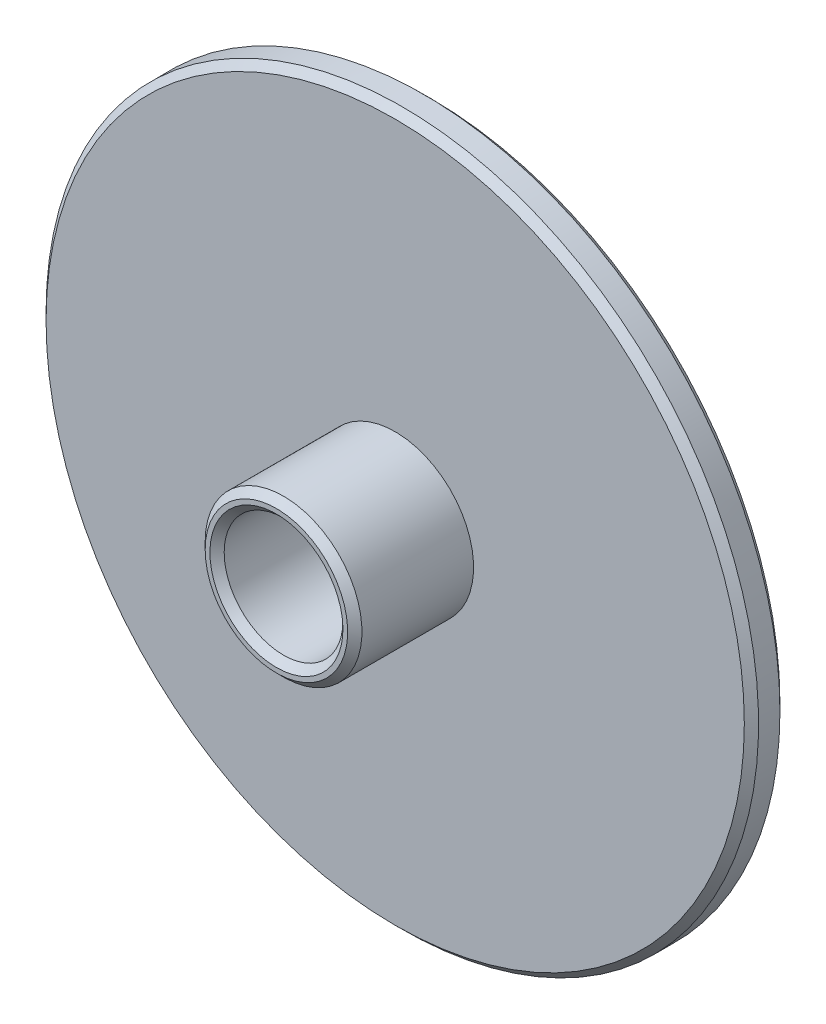
ISO-10303-21;
HEADER;
FILE_DESCRIPTION(('STEP AP214'),'2;1');
FILE_NAME('part.step','',(''),(''),'','','');
FILE_SCHEMA(('AUTOMOTIVE_DESIGN { 1 0 10303 214 1 1 1 1 }'));
ENDSEC;
DATA;
#1=APPLICATION_CONTEXT('core data for automotive mechanical design processes');
#2=APPLICATION_PROTOCOL_DEFINITION('international standard','automotive_design',2000,#1);
#3=PRODUCT_CONTEXT('',#1,'mechanical');
#4=PRODUCT('Part','Part','',(#3));
#5=PRODUCT_RELATED_PRODUCT_CATEGORY('part','',(#4));
#6=PRODUCT_DEFINITION_FORMATION('','',#4);
#7=PRODUCT_DEFINITION_CONTEXT('part definition',#1,'design');
#8=PRODUCT_DEFINITION('design','',#6,#7);
#9=PRODUCT_DEFINITION_SHAPE('','',#8);
#10=(LENGTH_UNIT() NAMED_UNIT(*) SI_UNIT(.MILLI.,.METRE.));
#11=(NAMED_UNIT(*) PLANE_ANGLE_UNIT() SI_UNIT($,.RADIAN.));
#12=(NAMED_UNIT(*) SI_UNIT($,.STERADIAN.) SOLID_ANGLE_UNIT());
#13=UNCERTAINTY_MEASURE_WITH_UNIT(LENGTH_MEASURE(1.E-05),#10,'distance_accuracy_value','');
#14=(GEOMETRIC_REPRESENTATION_CONTEXT(3) GLOBAL_UNCERTAINTY_ASSIGNED_CONTEXT((#13)) GLOBAL_UNIT_ASSIGNED_CONTEXT((#10,
#11,#12)) REPRESENTATION_CONTEXT('',''));
#15=CARTESIAN_POINT('',(0.,0.,0.));
#16=DIRECTION('',(0.,0.,1.));
#17=DIRECTION('',(1.,0.,0.));
#18=AXIS2_PLACEMENT_3D('',#15,#16,#17);
#19=CARTESIAN_POINT('',(0.,0.,1.5));
#20=DIRECTION('',(0.,0.,1.));
#21=DIRECTION('',(1.,0.,0.));
#22=AXIS2_PLACEMENT_3D('',#19,#20,#21);
#23=PLANE('',#22);
#24=CARTESIAN_POINT('',(0.,0.,1.5));
#25=DIRECTION('',(0.,0.,-1.));
#26=DIRECTION('',(-1.,0.,0.));
#27=AXIS2_PLACEMENT_3D('',#24,#25,#26);
#28=CIRCLE('',#27,2.5);
#29=CARTESIAN_POINT('',(-2.5,0.,1.5));
#30=VERTEX_POINT('',#29);
#31=EDGE_CURVE('E16',#30,#30,#28,.F.);
#32=ORIENTED_EDGE('',*,*,#31,.T.);
#33=EDGE_LOOP('',(#32));
#34=FACE_BOUND('',#33,.T.);
#35=ADVANCED_FACE('F13',(#34),#23,.T.);
#36=CARTESIAN_POINT('',(0.,0.,6.5));
#37=DIRECTION('',(0.,0.,-1.));
#38=DIRECTION('',(-1.,0.,0.));
#39=AXIS2_PLACEMENT_3D('',#36,#37,#38);
#40=CYLINDRICAL_SURFACE('',#39,2.5);
#41=CARTESIAN_POINT('',(0.,0.,6.19999999997844));
#42=DIRECTION('',(0.,0.,1.));
#43=DIRECTION('',(1.,0.,0.));
#44=AXIS2_PLACEMENT_3D('',#41,#42,#43);
#45=CIRCLE('',#44,2.49999999994088);
#46=CARTESIAN_POINT('',(2.49999999994088,0.,6.19999999997844));
#47=VERTEX_POINT('',#46);
#48=EDGE_CURVE('E29',#47,#47,#45,.T.);
#49=ORIENTED_EDGE('',*,*,#48,.T.);
#50=EDGE_LOOP('',(#49));
#51=FACE_BOUND('',#50,.T.);
#52=ORIENTED_EDGE('',*,*,#31,.F.);
#53=EDGE_LOOP('',(#52));
#54=FACE_BOUND('',#53,.T.);
#55=ADVANCED_FACE('F57',(#51,#54),#40,.F.);
#56=CARTESIAN_POINT('',(0.,0.,6.50000000001683));
#57=DIRECTION('',(0.,0.,1.));
#58=DIRECTION('',(0.,-1.,0.));
#59=AXIS2_PLACEMENT_3D('',#56,#57,#58);
#60=CONICAL_SURFACE('',#59,2.79999999997926,0.785398163397448);
#61=ORIENTED_EDGE('',*,*,#48,.F.);
#62=EDGE_LOOP('',(#61));
#63=FACE_BOUND('',#62,.T.);
#64=CARTESIAN_POINT('',(0.,0.,6.50000000001683));
#65=DIRECTION('',(0.,0.,1.));
#66=DIRECTION('',(0.,-1.,0.));
#67=AXIS2_PLACEMENT_3D('',#64,#65,#66);
#68=CIRCLE('',#67,2.79999999997926);
#69=CARTESIAN_POINT('',(0.,-2.79999999997926,6.50000000001683));
#70=VERTEX_POINT('',#69);
#71=EDGE_CURVE('E42',#70,#70,#68,.F.);
#72=ORIENTED_EDGE('',*,*,#71,.F.);
#73=EDGE_LOOP('',(#72));
#74=FACE_BOUND('',#73,.T.);
#75=ADVANCED_FACE('F59',(#63,#74),#60,.F.);
#76=CARTESIAN_POINT('',(0.,0.,6.5));
#77=DIRECTION('',(0.,0.,1.));
#78=DIRECTION('',(1.,0.,0.));
#79=AXIS2_PLACEMENT_3D('',#76,#77,#78);
#80=PLANE('',#79);
#81=ORIENTED_EDGE('',*,*,#71,.T.);
#82=EDGE_LOOP('',(#81));
#83=FACE_BOUND('',#82,.T.);
#84=CARTESIAN_POINT('',(0.,0.,6.49999999995998));
#85=DIRECTION('',(0.,0.,-1.));
#86=DIRECTION('',(-1.,0.,0.));
#87=AXIS2_PLACEMENT_3D('',#84,#85,#86);
#88=CIRCLE('',#87,2.9999999999859);
#89=CARTESIAN_POINT('',(-2.9999999999859,0.,6.49999999995998));
#90=VERTEX_POINT('',#89);
#91=EDGE_CURVE('E39',#90,#90,#88,.T.);
#92=ORIENTED_EDGE('',*,*,#91,.F.);
#93=EDGE_LOOP('',(#92));
#94=FACE_BOUND('',#93,.T.);
#95=ADVANCED_FACE('F64',(#83,#94),#80,.T.);
#96=CARTESIAN_POINT('',(0.,0.,6.19999999997844));
#97=DIRECTION('',(0.,0.,-1.));
#98=DIRECTION('',(-1.,0.,0.));
#99=AXIS2_PLACEMENT_3D('',#96,#97,#98);
#100=CONICAL_SURFACE('',#99,3.29999999996744,0.785398163397448);
#101=CARTESIAN_POINT('',(0.,0.,6.2));
#102=DIRECTION('',(0.,0.,-1.));
#103=DIRECTION('',(-1.,0.,0.));
#104=AXIS2_PLACEMENT_3D('',#101,#102,#103);
#105=CIRCLE('',#104,3.3);
#106=CARTESIAN_POINT('',(-3.3,0.,6.2));
#107=VERTEX_POINT('',#106);
#108=EDGE_CURVE('E38',#107,#107,#105,.T.);
#109=ORIENTED_EDGE('',*,*,#108,.F.);
#110=EDGE_LOOP('',(#109));
#111=FACE_BOUND('',#110,.T.);
#112=ORIENTED_EDGE('',*,*,#91,.T.);
#113=EDGE_LOOP('',(#112));
#114=FACE_BOUND('',#113,.T.);
#115=ADVANCED_FACE('F91',(#111,#114),#100,.T.);
#116=CARTESIAN_POINT('',(0.,0.,6.5));
#117=DIRECTION('',(0.,0.,-1.));
#118=DIRECTION('',(-1.,0.,0.));
#119=AXIS2_PLACEMENT_3D('',#116,#117,#118);
#120=CYLINDRICAL_SURFACE('',#119,3.3);
#121=CARTESIAN_POINT('',(0.,0.,1.5));
#122=DIRECTION('',(0.,0.,-1.));
#123=DIRECTION('',(-1.,0.,0.));
#124=AXIS2_PLACEMENT_3D('',#121,#122,#123);
#125=CIRCLE('',#124,3.3);
#126=CARTESIAN_POINT('',(-3.3,0.,1.5));
#127=VERTEX_POINT('',#126);
#128=EDGE_CURVE('E34',#127,#127,#125,.T.);
#129=ORIENTED_EDGE('',*,*,#128,.F.);
#130=EDGE_LOOP('',(#129));
#131=FACE_BOUND('',#130,.T.);
#132=ORIENTED_EDGE('',*,*,#108,.T.);
#133=EDGE_LOOP('',(#132));
#134=FACE_BOUND('',#133,.T.);
#135=ADVANCED_FACE('F88',(#131,#134),#120,.T.);
#136=CARTESIAN_POINT('',(0.,0.,1.5));
#137=DIRECTION('',(0.,0.,1.));
#138=DIRECTION('',(1.,0.,0.));
#139=AXIS2_PLACEMENT_3D('',#136,#137,#138);
#140=PLANE('',#139);
#141=ORIENTED_EDGE('',*,*,#128,.T.);
#142=EDGE_LOOP('',(#141));
#143=FACE_BOUND('',#142,.T.);
#144=CARTESIAN_POINT('',(0.,0.,1.5));
#145=DIRECTION('',(0.,0.,-1.));
#146=DIRECTION('',(-1.,0.,0.));
#147=AXIS2_PLACEMENT_3D('',#144,#145,#146);
#148=CIRCLE('',#147,14.7);
#149=CARTESIAN_POINT('',(-14.7,0.,1.5));
#150=VERTEX_POINT('',#149);
#151=EDGE_CURVE('E31',#150,#150,#148,.T.);
#152=ORIENTED_EDGE('',*,*,#151,.F.);
#153=EDGE_LOOP('',(#152));
#154=FACE_BOUND('',#153,.T.);
#155=ADVANCED_FACE('F85',(#143,#154),#140,.T.);
#156=CARTESIAN_POINT('',(0.,0.,1.19999999999998));
#157=DIRECTION('',(0.,0.,-1.));
#158=DIRECTION('',(-1.,0.,0.));
#159=AXIS2_PLACEMENT_3D('',#156,#157,#158);
#160=CONICAL_SURFACE('',#159,15.,0.78539816339745);
#161=ORIENTED_EDGE('',*,*,#151,.T.);
#162=EDGE_LOOP('',(#161));
#163=FACE_BOUND('',#162,.T.);
#164=CARTESIAN_POINT('',(0.,0.,1.19999999999998));
#165=DIRECTION('',(0.,0.,-1.));
#166=DIRECTION('',(-1.,0.,0.));
#167=AXIS2_PLACEMENT_3D('',#164,#165,#166);
#168=CIRCLE('',#167,15.);
#169=CARTESIAN_POINT('',(-15.,0.,1.19999999999998));
#170=VERTEX_POINT('',#169);
#171=EDGE_CURVE('E25',#170,#170,#168,.T.);
#172=ORIENTED_EDGE('',*,*,#171,.F.);
#173=EDGE_LOOP('',(#172));
#174=FACE_BOUND('',#173,.T.);
#175=ADVANCED_FACE('F81',(#163,#174),#160,.T.);
#176=CARTESIAN_POINT('',(0.,0.,1.5));
#177=DIRECTION('',(0.,0.,-1.));
#178=DIRECTION('',(-1.,0.,0.));
#179=AXIS2_PLACEMENT_3D('',#176,#177,#178);
#180=CYLINDRICAL_SURFACE('',#179,15.);
#181=ORIENTED_EDGE('',*,*,#171,.T.);
#182=EDGE_LOOP('',(#181));
#183=FACE_BOUND('',#182,.T.);
#184=CARTESIAN_POINT('',(0.,0.,0.299999999999989));
#185=DIRECTION('',(0.,0.,1.));
#186=DIRECTION('',(1.,0.,0.));
#187=AXIS2_PLACEMENT_3D('',#184,#185,#186);
#188=CIRCLE('',#187,15.);
#189=CARTESIAN_POINT('',(15.,0.,0.29999999999999));
#190=VERTEX_POINT('',#189);
#191=EDGE_CURVE('E20',#190,#190,#188,.F.);
#192=ORIENTED_EDGE('',*,*,#191,.F.);
#193=EDGE_LOOP('',(#192));
#194=FACE_BOUND('',#193,.T.);
#195=ADVANCED_FACE('F76',(#183,#194),#180,.T.);
#196=CARTESIAN_POINT('',(0.,0.,0.29999999999999));
#197=DIRECTION('',(0.,0.,1.));
#198=DIRECTION('',(1.,0.,0.));
#199=AXIS2_PLACEMENT_3D('',#196,#197,#198);
#200=CONICAL_SURFACE('',#199,15.,0.785398163397454);
#201=CARTESIAN_POINT('',(0.,0.,0.));
#202=DIRECTION('',(0.,0.,1.));
#203=DIRECTION('',(1.,0.,0.));
#204=AXIS2_PLACEMENT_3D('',#201,#202,#203);
#205=CIRCLE('',#204,14.7);
#206=CARTESIAN_POINT('',(14.7,0.,0.));
#207=VERTEX_POINT('',#206);
#208=EDGE_CURVE('E9',#207,#207,#205,.T.);
#209=ORIENTED_EDGE('',*,*,#208,.T.);
#210=EDGE_LOOP('',(#209));
#211=FACE_BOUND('',#210,.T.);
#212=ORIENTED_EDGE('',*,*,#191,.T.);
#213=EDGE_LOOP('',(#212));
#214=FACE_BOUND('',#213,.T.);
#215=ADVANCED_FACE('F70',(#211,#214),#200,.T.);
#216=CARTESIAN_POINT('',(0.,0.,0.));
#217=DIRECTION('',(0.,0.,1.));
#218=DIRECTION('',(1.,0.,0.));
#219=AXIS2_PLACEMENT_3D('',#216,#217,#218);
#220=PLANE('',#219);
#221=ORIENTED_EDGE('',*,*,#208,.F.);
#222=EDGE_LOOP('',(#221));
#223=FACE_BOUND('',#222,.T.);
#224=ADVANCED_FACE('F68',(#223),#220,.F.);
#225=CLOSED_SHELL('',(#35,#55,#75,#95,#115,#135,#155,#175,#195,#215,#224));
#226=MANIFOLD_SOLID_BREP('B1',#225);
#227=ADVANCED_BREP_SHAPE_REPRESENTATION('',(#18,#226),#14);
#228=SHAPE_DEFINITION_REPRESENTATION(#9,#227);
ENDSEC;
END-ISO-10303-21;
